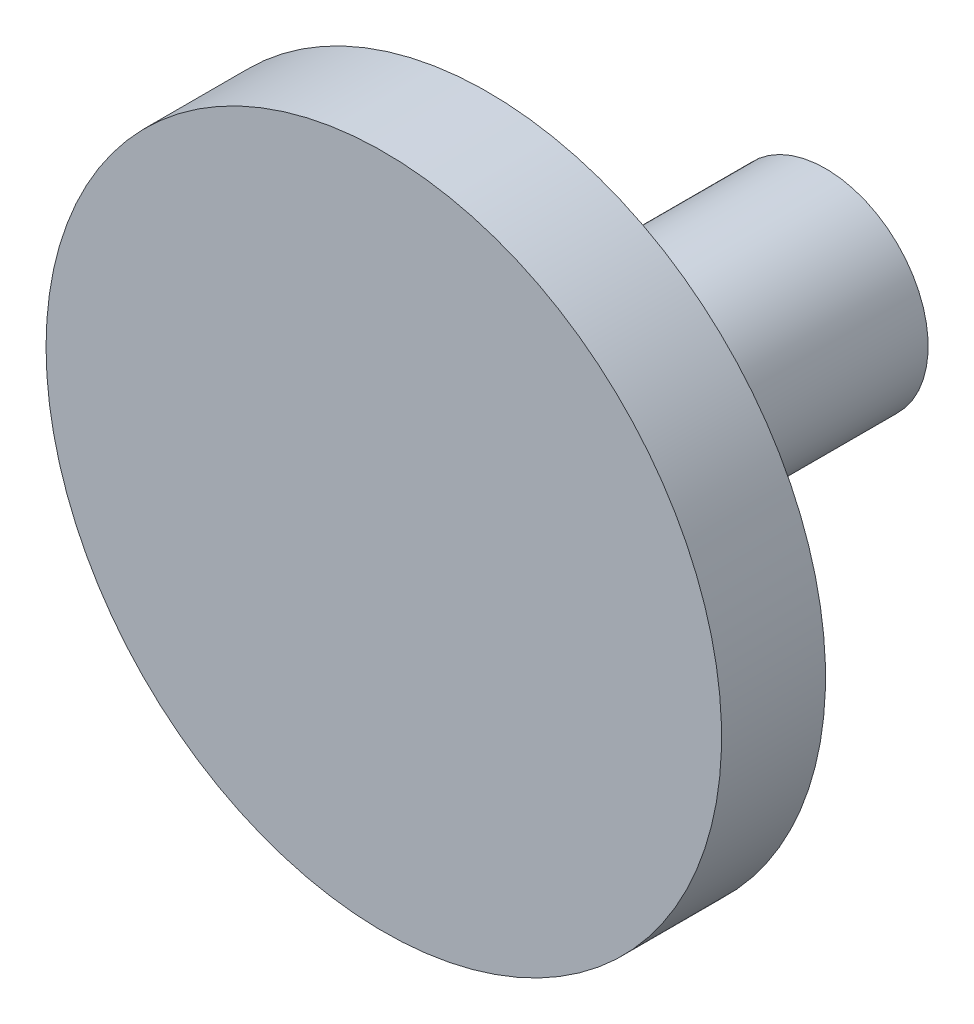
ISO-10303-21;
HEADER;
FILE_DESCRIPTION(('STEP AP214'),'2;1');
FILE_NAME('part.step','',(''),(''),'','','');
FILE_SCHEMA(('AUTOMOTIVE_DESIGN { 1 0 10303 214 1 1 1 1 }'));
ENDSEC;
DATA;
#1=APPLICATION_CONTEXT('core data for automotive mechanical design processes');
#2=APPLICATION_PROTOCOL_DEFINITION('international standard','automotive_design',2000,#1);
#3=PRODUCT_CONTEXT('',#1,'mechanical');
#4=PRODUCT('Part','Part','',(#3));
#5=PRODUCT_RELATED_PRODUCT_CATEGORY('part','',(#4));
#6=PRODUCT_DEFINITION_FORMATION('','',#4);
#7=PRODUCT_DEFINITION_CONTEXT('part definition',#1,'design');
#8=PRODUCT_DEFINITION('design','',#6,#7);
#9=PRODUCT_DEFINITION_SHAPE('','',#8);
#10=(LENGTH_UNIT() NAMED_UNIT(*) SI_UNIT(.MILLI.,.METRE.));
#11=(NAMED_UNIT(*) PLANE_ANGLE_UNIT() SI_UNIT($,.RADIAN.));
#12=(NAMED_UNIT(*) SI_UNIT($,.STERADIAN.) SOLID_ANGLE_UNIT());
#13=UNCERTAINTY_MEASURE_WITH_UNIT(LENGTH_MEASURE(1.E-05),#10,'distance_accuracy_value','');
#14=(GEOMETRIC_REPRESENTATION_CONTEXT(3) GLOBAL_UNCERTAINTY_ASSIGNED_CONTEXT((#13)) GLOBAL_UNIT_ASSIGNED_CONTEXT((#10,
#11,#12)) REPRESENTATION_CONTEXT('',''));
#15=CARTESIAN_POINT('',(0.,0.,0.));
#16=DIRECTION('',(0.,0.,1.));
#17=DIRECTION('',(1.,0.,0.));
#18=AXIS2_PLACEMENT_3D('',#15,#16,#17);
#19=CARTESIAN_POINT('',(-13.,0.,0.));
#20=DIRECTION('',(0.,0.,1.));
#21=DIRECTION('',(1.,0.,0.));
#22=AXIS2_PLACEMENT_3D('',#19,#20,#21);
#23=PLANE('',#22);
#24=CARTESIAN_POINT('',(0.,0.,0.));
#25=DIRECTION('',(0.,0.,-1.));
#26=DIRECTION('',(-1.,0.,0.));
#27=AXIS2_PLACEMENT_3D('',#24,#25,#26);
#28=CIRCLE('',#27,13.);
#29=CARTESIAN_POINT('',(-13.,0.,0.));
#30=VERTEX_POINT('',#29);
#31=EDGE_CURVE('E10',#30,#30,#28,.T.);
#32=ORIENTED_EDGE('',*,*,#31,.F.);
#33=EDGE_LOOP('',(#32));
#34=FACE_BOUND('',#33,.T.);
#35=ADVANCED_FACE('F43',(#34),#23,.T.);
#36=CARTESIAN_POINT('',(0.,0.,-21.8203776904257));
#37=DIRECTION('',(0.,0.,-1.));
#38=DIRECTION('',(-1.,0.,0.));
#39=AXIS2_PLACEMENT_3D('',#36,#37,#38);
#40=CYLINDRICAL_SURFACE('',#39,13.);
#41=ORIENTED_EDGE('',*,*,#31,.T.);
#42=EDGE_LOOP('',(#41));
#43=FACE_BOUND('',#42,.T.);
#44=CARTESIAN_POINT('',(0.,0.,-4.));
#45=DIRECTION('',(0.,0.,-1.));
#46=DIRECTION('',(-1.,0.,0.));
#47=AXIS2_PLACEMENT_3D('',#44,#45,#46);
#48=CIRCLE('',#47,13.);
#49=CARTESIAN_POINT('',(-13.,0.,-4.));
#50=VERTEX_POINT('',#49);
#51=EDGE_CURVE('E50',#50,#50,#48,.T.);
#52=ORIENTED_EDGE('',*,*,#51,.F.);
#53=EDGE_LOOP('',(#52));
#54=FACE_BOUND('',#53,.T.);
#55=ADVANCED_FACE('F91',(#43,#54),#40,.T.);
#56=CARTESIAN_POINT('',(-13.,0.,-4.));
#57=DIRECTION('',(0.,0.,-1.));
#58=DIRECTION('',(-1.,0.,0.));
#59=AXIS2_PLACEMENT_3D('',#56,#57,#58);
#60=PLANE('',#59);
#61=ORIENTED_EDGE('',*,*,#51,.T.);
#62=EDGE_LOOP('',(#61));
#63=FACE_BOUND('',#62,.T.);
#64=CARTESIAN_POINT('',(0.,0.,-4.));
#65=DIRECTION('',(0.,0.,-1.));
#66=DIRECTION('',(-1.,0.,0.));
#67=AXIS2_PLACEMENT_3D('',#64,#65,#66);
#68=CIRCLE('',#67,5.5);
#69=CARTESIAN_POINT('',(-5.5,0.,-4.));
#70=VERTEX_POINT('',#69);
#71=EDGE_CURVE('E55',#70,#70,#68,.T.);
#72=ORIENTED_EDGE('',*,*,#71,.F.);
#73=EDGE_LOOP('',(#72));
#74=FACE_BOUND('',#73,.T.);
#75=ADVANCED_FACE('F96',(#63,#74),#60,.T.);
#76=CARTESIAN_POINT('',(0.,0.,-21.8203776904257));
#77=DIRECTION('',(0.,0.,-1.));
#78=DIRECTION('',(-1.,0.,0.));
#79=AXIS2_PLACEMENT_3D('',#76,#77,#78);
#80=CYLINDRICAL_SURFACE('',#79,5.5);
#81=ORIENTED_EDGE('',*,*,#71,.T.);
#82=EDGE_LOOP('',(#81));
#83=FACE_BOUND('',#82,.T.);
#84=CARTESIAN_POINT('',(0.,0.,-7.));
#85=DIRECTION('',(0.,0.,-1.));
#86=DIRECTION('',(-1.,0.,0.));
#87=AXIS2_PLACEMENT_3D('',#84,#85,#86);
#88=CIRCLE('',#87,5.5);
#89=CARTESIAN_POINT('',(-5.5,0.,-7.));
#90=VERTEX_POINT('',#89);
#91=EDGE_CURVE('E60',#90,#90,#88,.T.);
#92=ORIENTED_EDGE('',*,*,#91,.F.);
#93=EDGE_LOOP('',(#92));
#94=FACE_BOUND('',#93,.T.);
#95=ADVANCED_FACE('F87',(#83,#94),#80,.T.);
#96=CARTESIAN_POINT('',(-5.5,0.,-7.));
#97=DIRECTION('',(0.,0.,-1.));
#98=DIRECTION('',(-1.,0.,0.));
#99=AXIS2_PLACEMENT_3D('',#96,#97,#98);
#100=PLANE('',#99);
#101=ORIENTED_EDGE('',*,*,#91,.T.);
#102=EDGE_LOOP('',(#101));
#103=FACE_BOUND('',#102,.T.);
#104=CARTESIAN_POINT('',(0.,0.,-7.));
#105=DIRECTION('',(0.,0.,-1.));
#106=DIRECTION('',(-1.,0.,0.));
#107=AXIS2_PLACEMENT_3D('',#104,#105,#106);
#108=CIRCLE('',#107,3.95);
#109=CARTESIAN_POINT('',(-3.95,0.,-7.));
#110=VERTEX_POINT('',#109);
#111=EDGE_CURVE('E66',#110,#110,#108,.T.);
#112=ORIENTED_EDGE('',*,*,#111,.F.);
#113=EDGE_LOOP('',(#112));
#114=FACE_BOUND('',#113,.T.);
#115=ADVANCED_FACE('F79',(#103,#114),#100,.T.);
#116=CARTESIAN_POINT('',(0.,0.,-21.8203776904257));
#117=DIRECTION('',(0.,0.,-1.));
#118=DIRECTION('',(-1.,0.,0.));
#119=AXIS2_PLACEMENT_3D('',#116,#117,#118);
#120=CYLINDRICAL_SURFACE('',#119,3.95);
#121=ORIENTED_EDGE('',*,*,#111,.T.);
#122=EDGE_LOOP('',(#121));
#123=FACE_BOUND('',#122,.T.);
#124=CARTESIAN_POINT('',(0.,0.,-17.));
#125=DIRECTION('',(0.,0.,-1.));
#126=DIRECTION('',(-1.,0.,0.));
#127=AXIS2_PLACEMENT_3D('',#124,#125,#126);
#128=CIRCLE('',#127,3.95);
#129=CARTESIAN_POINT('',(-3.95,0.,-17.));
#130=VERTEX_POINT('',#129);
#131=EDGE_CURVE('E70',#130,#130,#128,.T.);
#132=ORIENTED_EDGE('',*,*,#131,.F.);
#133=EDGE_LOOP('',(#132));
#134=FACE_BOUND('',#133,.T.);
#135=ADVANCED_FACE('F77',(#123,#134),#120,.T.);
#136=CARTESIAN_POINT('',(-3.95,0.,-17.));
#137=DIRECTION('',(0.,0.,-1.));
#138=DIRECTION('',(-1.,0.,0.));
#139=AXIS2_PLACEMENT_3D('',#136,#137,#138);
#140=PLANE('',#139);
#141=ORIENTED_EDGE('',*,*,#131,.T.);
#142=EDGE_LOOP('',(#141));
#143=FACE_BOUND('',#142,.T.);
#144=ADVANCED_FACE('F75',(#143),#140,.T.);
#145=CLOSED_SHELL('',(#35,#55,#75,#95,#115,#135,#144));
#146=MANIFOLD_SOLID_BREP('B2',#145);
#147=ADVANCED_BREP_SHAPE_REPRESENTATION('',(#18,#146),#14);
#148=SHAPE_DEFINITION_REPRESENTATION(#9,#147);
ENDSEC;
END-ISO-10303-21;
